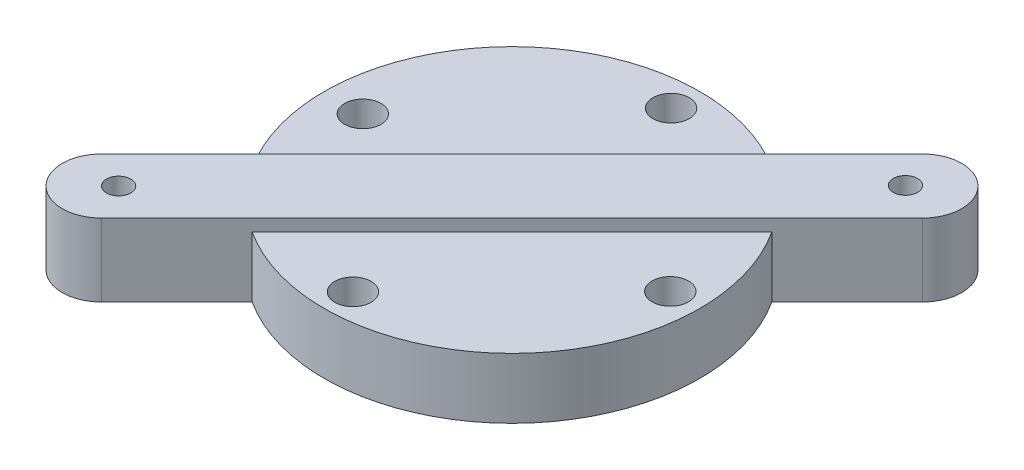
ISO-10303-21;
HEADER;
FILE_DESCRIPTION(('STEP AP214'),'2;1');
FILE_NAME('part.step','',(''),(''),'','','');
FILE_SCHEMA(('AUTOMOTIVE_DESIGN { 1 0 10303 214 1 1 1 1 }'));
ENDSEC;
DATA;
#1=APPLICATION_CONTEXT('core data for automotive mechanical design processes');
#2=APPLICATION_PROTOCOL_DEFINITION('international standard','automotive_design',2000,#1);
#3=PRODUCT_CONTEXT('',#1,'mechanical');
#4=PRODUCT('Part','Part','',(#3));
#5=PRODUCT_RELATED_PRODUCT_CATEGORY('part','',(#4));
#6=PRODUCT_DEFINITION_FORMATION('','',#4);
#7=PRODUCT_DEFINITION_CONTEXT('part definition',#1,'design');
#8=PRODUCT_DEFINITION('design','',#6,#7);
#9=PRODUCT_DEFINITION_SHAPE('','',#8);
#10=(LENGTH_UNIT() NAMED_UNIT(*) SI_UNIT(.MILLI.,.METRE.));
#11=(NAMED_UNIT(*) PLANE_ANGLE_UNIT() SI_UNIT($,.RADIAN.));
#12=(NAMED_UNIT(*) SI_UNIT($,.STERADIAN.) SOLID_ANGLE_UNIT());
#13=UNCERTAINTY_MEASURE_WITH_UNIT(LENGTH_MEASURE(1.E-05),#10,'distance_accuracy_value','');
#14=(GEOMETRIC_REPRESENTATION_CONTEXT(3) GLOBAL_UNCERTAINTY_ASSIGNED_CONTEXT((#13)) GLOBAL_UNIT_ASSIGNED_CONTEXT((#10,
#11,#12)) REPRESENTATION_CONTEXT('',''));
#15=CARTESIAN_POINT('',(0.,0.,0.));
#16=DIRECTION('',(0.,0.,1.));
#17=DIRECTION('',(1.,0.,0.));
#18=AXIS2_PLACEMENT_3D('',#15,#16,#17);
#19=CARTESIAN_POINT('',(0.,10.,0.));
#20=DIRECTION('',(0.,-1.,0.));
#21=DIRECTION('',(0.,0.,-1.));
#22=AXIS2_PLACEMENT_3D('',#19,#20,#21);
#23=CYLINDRICAL_SURFACE('',#22,31.);
#24=DIRECTION('',(0.,-1.,0.));
#25=VECTOR('',#24,1.);
#26=CARTESIAN_POINT('',(26.0154139470055,10.,-16.8581801261569));
#27=LINE('',#26,#25);
#28=CARTESIAN_POINT('',(26.0154139470055,10.,-16.8581801261569));
#29=VERTEX_POINT('',#28);
#30=CARTESIAN_POINT('',(26.0154139470055,0.,-16.8581801261569));
#31=VERTEX_POINT('',#30);
#32=EDGE_CURVE('E158',#29,#31,#27,.T.);
#33=ORIENTED_EDGE('',*,*,#32,.F.);
#34=CARTESIAN_POINT('',(0.,10.,0.));
#35=DIRECTION('',(0.,1.,0.));
#36=DIRECTION('',(0.,0.,1.));
#37=AXIS2_PLACEMENT_3D('',#34,#35,#36);
#38=CIRCLE('',#37,31.);
#39=CARTESIAN_POINT('',(-16.8581801261569,10.,26.0154139470055));
#40=VERTEX_POINT('',#39);
#41=EDGE_CURVE('E54',#40,#29,#38,.T.);
#42=ORIENTED_EDGE('',*,*,#41,.F.);
#43=DIRECTION('',(0.,-1.,0.));
#44=VECTOR('',#43,1.);
#45=CARTESIAN_POINT('',(-16.8581801261568,10.,26.0154139470055));
#46=LINE('',#45,#44);
#47=CARTESIAN_POINT('',(-16.8581801261569,0.,26.0154139470055));
#48=VERTEX_POINT('',#47);
#49=EDGE_CURVE('E69',#48,#40,#46,.F.);
#50=ORIENTED_EDGE('',*,*,#49,.F.);
#51=CARTESIAN_POINT('',(0.,0.,0.));
#52=DIRECTION('',(0.,1.,0.));
#53=DIRECTION('',(0.,0.,1.));
#54=AXIS2_PLACEMENT_3D('',#51,#52,#53);
#55=CIRCLE('',#54,31.);
#56=EDGE_CURVE('E48',#48,#31,#55,.T.);
#57=ORIENTED_EDGE('',*,*,#56,.T.);
#58=EDGE_LOOP('',(#33,#42,#50,#57));
#59=FACE_BOUND('',#58,.T.);
#60=ADVANCED_FACE('F45',(#59),#23,.T.);
#61=DIRECTION('',(0.,-1.,0.));
#62=VECTOR('',#61,1.);
#63=CARTESIAN_POINT('',(-26.0154139470055,10.,16.8581801261569));
#64=LINE('',#63,#62);
#65=CARTESIAN_POINT('',(-26.0154139470055,10.,16.8581801261569));
#66=VERTEX_POINT('',#65);
#67=CARTESIAN_POINT('',(-26.0154139470055,0.,16.8581801261569));
#68=VERTEX_POINT('',#67);
#69=EDGE_CURVE('E150',#66,#68,#64,.T.);
#70=ORIENTED_EDGE('',*,*,#69,.F.);
#71=CARTESIAN_POINT('',(16.8581801261569,10.,-26.0154139470055));
#72=VERTEX_POINT('',#71);
#73=EDGE_CURVE('E11',#72,#66,#38,.T.);
#74=ORIENTED_EDGE('',*,*,#73,.F.);
#75=DIRECTION('',(0.,-1.,0.));
#76=VECTOR('',#75,1.);
#77=CARTESIAN_POINT('',(16.8581801261568,10.,-26.0154139470055));
#78=LINE('',#77,#76);
#79=CARTESIAN_POINT('',(16.8581801261568,0.,-26.0154139470055));
#80=VERTEX_POINT('',#79);
#81=EDGE_CURVE('E61',#80,#72,#78,.F.);
#82=ORIENTED_EDGE('',*,*,#81,.F.);
#83=EDGE_CURVE('E194',#80,#68,#55,.T.);
#84=ORIENTED_EDGE('',*,*,#83,.T.);
#85=EDGE_LOOP('',(#70,#74,#82,#84));
#86=FACE_BOUND('',#85,.T.);
#87=ADVANCED_FACE('F273',(#86),#23,.T.);
#88=CARTESIAN_POINT('',(0.,10.,0.));
#89=DIRECTION('',(0.,1.,0.));
#90=DIRECTION('',(0.,0.,1.));
#91=AXIS2_PLACEMENT_3D('',#88,#89,#90);
#92=PLANE('',#91);
#93=CARTESIAN_POINT('',(26.1230277421703,10.,0.));
#94=DIRECTION('',(0.,1.,0.));
#95=DIRECTION('',(0.,0.,1.));
#96=AXIS2_PLACEMENT_3D('',#93,#94,#95);
#97=CIRCLE('',#96,3.);
#98=CARTESIAN_POINT('',(26.1230277421703,10.,3.));
#99=VERTEX_POINT('',#98);
#100=EDGE_CURVE('E174',#99,#99,#97,.T.);
#101=ORIENTED_EDGE('',*,*,#100,.F.);
#102=EDGE_LOOP('',(#101));
#103=FACE_BOUND('',#102,.T.);
#104=CARTESIAN_POINT('',(0.,10.,26.2486192217));
#105=DIRECTION('',(0.,1.,0.));
#106=DIRECTION('',(0.,0.,1.));
#107=AXIS2_PLACEMENT_3D('',#104,#105,#106);
#108=CIRCLE('',#107,3.);
#109=CARTESIAN_POINT('',(0.,10.,29.2486192217));
#110=VERTEX_POINT('',#109);
#111=EDGE_CURVE('E161',#110,#110,#108,.T.);
#112=ORIENTED_EDGE('',*,*,#111,.F.);
#113=EDGE_LOOP('',(#112));
#114=FACE_BOUND('',#113,.T.);
#115=ORIENTED_EDGE('',*,*,#41,.T.);
#116=DIRECTION('',(-0.707106781186546,0.,0.707106781186549));
#117=VECTOR('',#116,1.);
#118=CARTESIAN_POINT('',(4.57861691042431,10.,4.5786169104243));
#119=LINE('',#118,#117);
#120=EDGE_CURVE('E153',#29,#40,#119,.T.);
#121=ORIENTED_EDGE('',*,*,#120,.T.);
#122=EDGE_LOOP('',(#115,#121));
#123=FACE_BOUND('',#122,.T.);
#124=ADVANCED_FACE('F278',(#103,#114,#123),#92,.T.);
#125=CARTESIAN_POINT('',(-24.6159299878143,10.,0.));
#126=DIRECTION('',(0.,1.,0.));
#127=DIRECTION('',(0.,0.,1.));
#128=AXIS2_PLACEMENT_3D('',#125,#126,#127);
#129=CIRCLE('',#128,3.);
#130=CARTESIAN_POINT('',(-24.6159299878143,10.,3.));
#131=VERTEX_POINT('',#130);
#132=EDGE_CURVE('E182',#131,#131,#129,.T.);
#133=ORIENTED_EDGE('',*,*,#132,.F.);
#134=EDGE_LOOP('',(#133));
#135=FACE_BOUND('',#134,.T.);
#136=CARTESIAN_POINT('',(0.,10.,-26.2486192216999));
#137=DIRECTION('',(0.,1.,0.));
#138=DIRECTION('',(0.,0.,1.));
#139=AXIS2_PLACEMENT_3D('',#136,#137,#138);
#140=CIRCLE('',#139,3.);
#141=CARTESIAN_POINT('',(0.,10.,-23.2486192216999));
#142=VERTEX_POINT('',#141);
#143=EDGE_CURVE('E162',#142,#142,#140,.T.);
#144=ORIENTED_EDGE('',*,*,#143,.F.);
#145=EDGE_LOOP('',(#144));
#146=FACE_BOUND('',#145,.T.);
#147=ORIENTED_EDGE('',*,*,#73,.T.);
#148=DIRECTION('',(0.707106781186546,0.,-0.707106781186549));
#149=VECTOR('',#148,1.);
#150=CARTESIAN_POINT('',(-4.57861691042431,10.,-4.5786169104243));
#151=LINE('',#150,#149);
#152=EDGE_CURVE('E139',#66,#72,#151,.T.);
#153=ORIENTED_EDGE('',*,*,#152,.T.);
#154=EDGE_LOOP('',(#147,#153));
#155=FACE_BOUND('',#154,.T.);
#156=ADVANCED_FACE('F282',(#135,#146,#155),#92,.T.);
#157=CARTESIAN_POINT('',(0.,0.,0.));
#158=DIRECTION('',(0.,1.,0.));
#159=DIRECTION('',(0.,0.,1.));
#160=AXIS2_PLACEMENT_3D('',#157,#158,#159);
#161=PLANE('',#160);
#162=ORIENTED_EDGE('',*,*,#83,.F.);
#163=DIRECTION('',(-0.707106781186546,0.,0.707106781186549));
#164=VECTOR('',#163,1.);
#165=CARTESIAN_POINT('',(-38.4490066018234,0.,29.2917727809749));
#166=LINE('',#165,#164);
#167=CARTESIAN_POINT('',(29.2917727809748,0.,-38.4490066018235));
#168=VERTEX_POINT('',#167);
#169=EDGE_CURVE('E133',#168,#80,#166,.T.);
#170=ORIENTED_EDGE('',*,*,#169,.F.);
#171=CARTESIAN_POINT('',(33.8703896913991,0.,-33.8703896913992));
#172=DIRECTION('',(0.,1.,0.));
#173=DIRECTION('',(0.,0.,1.));
#174=AXIS2_PLACEMENT_3D('',#171,#172,#173);
#175=CIRCLE('',#174,6.47514213163285);
#176=CARTESIAN_POINT('',(38.4490066018234,0.,-29.2917727809749));
#177=VERTEX_POINT('',#176);
#178=EDGE_CURVE('E215',#177,#168,#175,.T.);
#179=ORIENTED_EDGE('',*,*,#178,.F.);
#180=DIRECTION('',(0.707106781186546,0.,-0.707106781186549));
#181=VECTOR('',#180,1.);
#182=CARTESIAN_POINT('',(-29.2917727809748,0.,38.4490066018235));
#183=LINE('',#182,#181);
#184=EDGE_CURVE('E213',#31,#177,#183,.T.);
#185=ORIENTED_EDGE('',*,*,#184,.F.);
#186=ORIENTED_EDGE('',*,*,#56,.F.);
#187=CARTESIAN_POINT('',(-29.2917727809748,0.,38.4490066018235));
#188=VERTEX_POINT('',#187);
#189=EDGE_CURVE('E211',#188,#48,#183,.T.);
#190=ORIENTED_EDGE('',*,*,#189,.F.);
#191=CARTESIAN_POINT('',(-33.8703896913991,0.,33.8703896913992));
#192=DIRECTION('',(0.,1.,0.));
#193=DIRECTION('',(0.,0.,1.));
#194=AXIS2_PLACEMENT_3D('',#191,#192,#193);
#195=CIRCLE('',#194,6.47514213163285);
#196=CARTESIAN_POINT('',(-38.4490066018234,0.,29.2917727809749));
#197=VERTEX_POINT('',#196);
#198=EDGE_CURVE('E137',#197,#188,#195,.T.);
#199=ORIENTED_EDGE('',*,*,#198,.F.);
#200=EDGE_CURVE('E226',#68,#197,#166,.T.);
#201=ORIENTED_EDGE('',*,*,#200,.F.);
#202=EDGE_LOOP('',(#162,#170,#179,#185,#186,#190,#199,#201));
#203=FACE_BOUND('',#202,.T.);
#204=CARTESIAN_POINT('',(-24.6159299878143,0.,0.));
#205=DIRECTION('',(0.,1.,0.));
#206=DIRECTION('',(0.,0.,1.));
#207=AXIS2_PLACEMENT_3D('',#204,#205,#206);
#208=CIRCLE('',#207,3.);
#209=CARTESIAN_POINT('',(-24.6159299878143,0.,3.));
#210=VERTEX_POINT('',#209);
#211=EDGE_CURVE('E178',#210,#210,#208,.T.);
#212=ORIENTED_EDGE('',*,*,#211,.T.);
#213=EDGE_LOOP('',(#212));
#214=FACE_BOUND('',#213,.T.);
#215=CARTESIAN_POINT('',(0.,0.,-26.2486192216999));
#216=DIRECTION('',(0.,1.,0.));
#217=DIRECTION('',(0.,0.,1.));
#218=AXIS2_PLACEMENT_3D('',#215,#216,#217);
#219=CIRCLE('',#218,3.);
#220=CARTESIAN_POINT('',(0.,0.,-23.2486192216999));
#221=VERTEX_POINT('',#220);
#222=EDGE_CURVE('E166',#221,#221,#219,.T.);
#223=ORIENTED_EDGE('',*,*,#222,.T.);
#224=EDGE_LOOP('',(#223));
#225=FACE_BOUND('',#224,.T.);
#226=CARTESIAN_POINT('',(0.,0.,26.2486192217));
#227=DIRECTION('',(0.,1.,0.));
#228=DIRECTION('',(0.,0.,1.));
#229=AXIS2_PLACEMENT_3D('',#226,#227,#228);
#230=CIRCLE('',#229,3.);
#231=CARTESIAN_POINT('',(0.,0.,29.2486192217));
#232=VERTEX_POINT('',#231);
#233=EDGE_CURVE('E186',#232,#232,#230,.T.);
#234=ORIENTED_EDGE('',*,*,#233,.T.);
#235=EDGE_LOOP('',(#234));
#236=FACE_BOUND('',#235,.T.);
#237=CARTESIAN_POINT('',(26.1230277421703,0.,0.));
#238=DIRECTION('',(0.,1.,0.));
#239=DIRECTION('',(0.,0.,1.));
#240=AXIS2_PLACEMENT_3D('',#237,#238,#239);
#241=CIRCLE('',#240,3.);
#242=CARTESIAN_POINT('',(26.1230277421703,0.,3.));
#243=VERTEX_POINT('',#242);
#244=EDGE_CURVE('E170',#243,#243,#241,.T.);
#245=ORIENTED_EDGE('',*,*,#244,.T.);
#246=EDGE_LOOP('',(#245));
#247=FACE_BOUND('',#246,.T.);
#248=CARTESIAN_POINT('',(-32.456176129026,0.,32.4561761290261));
#249=DIRECTION('',(0.,1.,0.));
#250=DIRECTION('',(0.,0.,1.));
#251=AXIS2_PLACEMENT_3D('',#248,#249,#250);
#252=CIRCLE('',#251,2.);
#253=CARTESIAN_POINT('',(-32.456176129026,0.,34.4561761290261));
#254=VERTEX_POINT('',#253);
#255=EDGE_CURVE('E250',#254,#254,#252,.T.);
#256=ORIENTED_EDGE('',*,*,#255,.T.);
#257=EDGE_LOOP('',(#256));
#258=FACE_BOUND('',#257,.T.);
#259=CARTESIAN_POINT('',(32.3762467728126,0.,-32.5409022191612));
#260=DIRECTION('',(0.,1.,0.));
#261=DIRECTION('',(0.,0.,1.));
#262=AXIS2_PLACEMENT_3D('',#259,#260,#261);
#263=CIRCLE('',#262,2.);
#264=CARTESIAN_POINT('',(32.3762467728126,0.,-30.5409022191612));
#265=VERTEX_POINT('',#264);
#266=EDGE_CURVE('E242',#265,#265,#263,.T.);
#267=ORIENTED_EDGE('',*,*,#266,.T.);
#268=EDGE_LOOP('',(#267));
#269=FACE_BOUND('',#268,.T.);
#270=ADVANCED_FACE('F209',(#203,#214,#225,#236,#247,#258,#269),#161,.F.);
#271=CARTESIAN_POINT('',(0.,10.,26.2486192217));
#272=DIRECTION('',(0.,-1.,0.));
#273=DIRECTION('',(0.,0.,-1.));
#274=AXIS2_PLACEMENT_3D('',#271,#272,#273);
#275=CYLINDRICAL_SURFACE('',#274,3.);
#276=ORIENTED_EDGE('',*,*,#111,.T.);
#277=EDGE_LOOP('',(#276));
#278=FACE_BOUND('',#277,.T.);
#279=ORIENTED_EDGE('',*,*,#233,.F.);
#280=EDGE_LOOP('',(#279));
#281=FACE_BOUND('',#280,.T.);
#282=ADVANCED_FACE('F292',(#278,#281),#275,.F.);
#283=CARTESIAN_POINT('',(-24.6159299878143,10.,0.));
#284=DIRECTION('',(0.,-1.,0.));
#285=DIRECTION('',(0.,0.,-1.));
#286=AXIS2_PLACEMENT_3D('',#283,#284,#285);
#287=CYLINDRICAL_SURFACE('',#286,3.);
#288=ORIENTED_EDGE('',*,*,#132,.T.);
#289=EDGE_LOOP('',(#288));
#290=FACE_BOUND('',#289,.T.);
#291=ORIENTED_EDGE('',*,*,#211,.F.);
#292=EDGE_LOOP('',(#291));
#293=FACE_BOUND('',#292,.T.);
#294=ADVANCED_FACE('F298',(#290,#293),#287,.F.);
#295=CARTESIAN_POINT('',(26.1230277421703,10.,0.));
#296=DIRECTION('',(0.,-1.,0.));
#297=DIRECTION('',(0.,0.,-1.));
#298=AXIS2_PLACEMENT_3D('',#295,#296,#297);
#299=CYLINDRICAL_SURFACE('',#298,3.);
#300=ORIENTED_EDGE('',*,*,#100,.T.);
#301=EDGE_LOOP('',(#300));
#302=FACE_BOUND('',#301,.T.);
#303=ORIENTED_EDGE('',*,*,#244,.F.);
#304=EDGE_LOOP('',(#303));
#305=FACE_BOUND('',#304,.T.);
#306=ADVANCED_FACE('F302',(#302,#305),#299,.F.);
#307=CARTESIAN_POINT('',(0.,10.,-26.2486192216999));
#308=DIRECTION('',(0.,-1.,0.));
#309=DIRECTION('',(0.,0.,-1.));
#310=AXIS2_PLACEMENT_3D('',#307,#308,#309);
#311=CYLINDRICAL_SURFACE('',#310,3.);
#312=ORIENTED_EDGE('',*,*,#143,.T.);
#313=EDGE_LOOP('',(#312));
#314=FACE_BOUND('',#313,.T.);
#315=ORIENTED_EDGE('',*,*,#222,.F.);
#316=EDGE_LOOP('',(#315));
#317=FACE_BOUND('',#316,.T.);
#318=ADVANCED_FACE('F306',(#314,#317),#311,.F.);
#319=CARTESIAN_POINT('',(-29.2917727809748,12.,38.4490066018235));
#320=DIRECTION('',(-0.707106781186549,0.,-0.707106781186546));
#321=DIRECTION('',(-0.707106781186546,0.,0.707106781186549));
#322=AXIS2_PLACEMENT_3D('',#319,#320,#321);
#323=PLANE('',#322);
#324=ORIENTED_EDGE('',*,*,#120,.F.);
#325=ORIENTED_EDGE('',*,*,#32,.T.);
#326=ORIENTED_EDGE('',*,*,#184,.T.);
#327=DIRECTION('',(0.,-1.,0.));
#328=VECTOR('',#327,1.);
#329=CARTESIAN_POINT('',(38.4490066018234,12.,-29.2917727809749));
#330=LINE('',#329,#328);
#331=CARTESIAN_POINT('',(38.4490066018234,12.,-29.2917727809749));
#332=VERTEX_POINT('',#331);
#333=EDGE_CURVE('E117',#332,#177,#330,.T.);
#334=ORIENTED_EDGE('',*,*,#333,.F.);
#335=DIRECTION('',(0.707106781186546,0.,-0.707106781186549));
#336=VECTOR('',#335,1.);
#337=CARTESIAN_POINT('',(-29.2917727809748,12.,38.4490066018235));
#338=LINE('',#337,#336);
#339=CARTESIAN_POINT('',(-29.2917727809748,12.,38.4490066018235));
#340=VERTEX_POINT('',#339);
#341=EDGE_CURVE('E110',#340,#332,#338,.T.);
#342=ORIENTED_EDGE('',*,*,#341,.F.);
#343=DIRECTION('',(0.,-1.,0.));
#344=VECTOR('',#343,1.);
#345=CARTESIAN_POINT('',(-29.2917727809748,12.,38.4490066018235));
#346=LINE('',#345,#344);
#347=EDGE_CURVE('E114',#340,#188,#346,.T.);
#348=ORIENTED_EDGE('',*,*,#347,.T.);
#349=ORIENTED_EDGE('',*,*,#189,.T.);
#350=ORIENTED_EDGE('',*,*,#49,.T.);
#351=EDGE_LOOP('',(#324,#325,#326,#334,#342,#348,#349,#350));
#352=FACE_BOUND('',#351,.T.);
#353=ADVANCED_FACE('F112',(#352),#323,.F.);
#354=CARTESIAN_POINT('',(-38.4490066018234,12.,29.2917727809749));
#355=DIRECTION('',(0.707106781186549,0.,0.707106781186546));
#356=DIRECTION('',(0.707106781186546,0.,-0.707106781186549));
#357=AXIS2_PLACEMENT_3D('',#354,#355,#356);
#358=PLANE('',#357);
#359=ORIENTED_EDGE('',*,*,#152,.F.);
#360=ORIENTED_EDGE('',*,*,#69,.T.);
#361=ORIENTED_EDGE('',*,*,#200,.T.);
#362=DIRECTION('',(0.,-1.,0.));
#363=VECTOR('',#362,1.);
#364=CARTESIAN_POINT('',(-38.4490066018234,12.,29.2917727809749));
#365=LINE('',#364,#363);
#366=CARTESIAN_POINT('',(-38.4490066018234,12.,29.2917727809749));
#367=VERTEX_POINT('',#366);
#368=EDGE_CURVE('E229',#367,#197,#365,.T.);
#369=ORIENTED_EDGE('',*,*,#368,.F.);
#370=DIRECTION('',(-0.707106781186546,0.,0.707106781186549));
#371=VECTOR('',#370,1.);
#372=CARTESIAN_POINT('',(-38.4490066018234,12.,29.2917727809749));
#373=LINE('',#372,#371);
#374=CARTESIAN_POINT('',(29.2917727809748,12.,-38.4490066018235));
#375=VERTEX_POINT('',#374);
#376=EDGE_CURVE('E128',#375,#367,#373,.T.);
#377=ORIENTED_EDGE('',*,*,#376,.F.);
#378=DIRECTION('',(0.,-1.,0.));
#379=VECTOR('',#378,1.);
#380=CARTESIAN_POINT('',(29.2917727809748,12.,-38.4490066018235));
#381=LINE('',#380,#379);
#382=EDGE_CURVE('E144',#375,#168,#381,.T.);
#383=ORIENTED_EDGE('',*,*,#382,.T.);
#384=ORIENTED_EDGE('',*,*,#169,.T.);
#385=ORIENTED_EDGE('',*,*,#81,.T.);
#386=EDGE_LOOP('',(#359,#360,#361,#369,#377,#383,#384,#385));
#387=FACE_BOUND('',#386,.T.);
#388=ADVANCED_FACE('F234',(#387),#358,.F.);
#389=CARTESIAN_POINT('',(-33.8703896913991,12.,33.8703896913992));
#390=DIRECTION('',(0.,1.,0.));
#391=DIRECTION('',(0.,0.,1.));
#392=AXIS2_PLACEMENT_3D('',#389,#390,#391);
#393=PLANE('',#392);
#394=CARTESIAN_POINT('',(32.3762467728126,12.,-32.5409022191612));
#395=DIRECTION('',(0.,1.,0.));
#396=DIRECTION('',(0.,0.,1.));
#397=AXIS2_PLACEMENT_3D('',#394,#395,#396);
#398=CIRCLE('',#397,2.);
#399=CARTESIAN_POINT('',(32.3762467728126,12.,-30.5409022191612));
#400=VERTEX_POINT('',#399);
#401=EDGE_CURVE('E220',#400,#400,#398,.T.);
#402=ORIENTED_EDGE('',*,*,#401,.F.);
#403=EDGE_LOOP('',(#402));
#404=FACE_BOUND('',#403,.T.);
#405=CARTESIAN_POINT('',(-33.8703896913991,12.,33.8703896913992));
#406=DIRECTION('',(0.,1.,0.));
#407=DIRECTION('',(0.,0.,1.));
#408=AXIS2_PLACEMENT_3D('',#405,#406,#407);
#409=CIRCLE('',#408,6.47514213163285);
#410=EDGE_CURVE('E122',#367,#340,#409,.T.);
#411=ORIENTED_EDGE('',*,*,#410,.T.);
#412=ORIENTED_EDGE('',*,*,#341,.T.);
#413=CARTESIAN_POINT('',(33.8703896913991,12.,-33.8703896913992));
#414=DIRECTION('',(0.,1.,0.));
#415=DIRECTION('',(0.,0.,1.));
#416=AXIS2_PLACEMENT_3D('',#413,#414,#415);
#417=CIRCLE('',#416,6.47514213163285);
#418=EDGE_CURVE('E121',#332,#375,#417,.T.);
#419=ORIENTED_EDGE('',*,*,#418,.T.);
#420=ORIENTED_EDGE('',*,*,#376,.T.);
#421=EDGE_LOOP('',(#411,#412,#419,#420));
#422=FACE_BOUND('',#421,.T.);
#423=CARTESIAN_POINT('',(-32.456176129026,12.,32.4561761290261));
#424=DIRECTION('',(0.,1.,0.));
#425=DIRECTION('',(0.,0.,1.));
#426=AXIS2_PLACEMENT_3D('',#423,#424,#425);
#427=CIRCLE('',#426,2.);
#428=CARTESIAN_POINT('',(-32.456176129026,12.,34.4561761290261));
#429=VERTEX_POINT('',#428);
#430=EDGE_CURVE('E246',#429,#429,#427,.T.);
#431=ORIENTED_EDGE('',*,*,#430,.F.);
#432=EDGE_LOOP('',(#431));
#433=FACE_BOUND('',#432,.T.);
#434=ADVANCED_FACE('F125',(#404,#422,#433),#393,.T.);
#435=CARTESIAN_POINT('',(-33.8703896913991,12.,33.8703896913992));
#436=DIRECTION('',(0.,-1.,0.));
#437=DIRECTION('',(0.,0.,-1.));
#438=AXIS2_PLACEMENT_3D('',#435,#436,#437);
#439=CYLINDRICAL_SURFACE('',#438,6.47514213163285);
#440=ORIENTED_EDGE('',*,*,#198,.T.);
#441=ORIENTED_EDGE('',*,*,#347,.F.);
#442=ORIENTED_EDGE('',*,*,#410,.F.);
#443=ORIENTED_EDGE('',*,*,#368,.T.);
#444=EDGE_LOOP('',(#440,#441,#442,#443));
#445=FACE_BOUND('',#444,.T.);
#446=ADVANCED_FACE('F135',(#445),#439,.T.);
#447=CARTESIAN_POINT('',(33.8703896913991,12.,-33.8703896913992));
#448=DIRECTION('',(0.,-1.,0.));
#449=DIRECTION('',(0.,0.,-1.));
#450=AXIS2_PLACEMENT_3D('',#447,#448,#449);
#451=CYLINDRICAL_SURFACE('',#450,6.47514213163285);
#452=ORIENTED_EDGE('',*,*,#178,.T.);
#453=ORIENTED_EDGE('',*,*,#382,.F.);
#454=ORIENTED_EDGE('',*,*,#418,.F.);
#455=ORIENTED_EDGE('',*,*,#333,.T.);
#456=EDGE_LOOP('',(#452,#453,#454,#455));
#457=FACE_BOUND('',#456,.T.);
#458=ADVANCED_FACE('F267',(#457),#451,.T.);
#459=CARTESIAN_POINT('',(32.3762467728126,12.,-32.5409022191612));
#460=DIRECTION('',(0.,-1.,0.));
#461=DIRECTION('',(0.,0.,-1.));
#462=AXIS2_PLACEMENT_3D('',#459,#460,#461);
#463=CYLINDRICAL_SURFACE('',#462,2.);
#464=ORIENTED_EDGE('',*,*,#401,.T.);
#465=EDGE_LOOP('',(#464));
#466=FACE_BOUND('',#465,.T.);
#467=ORIENTED_EDGE('',*,*,#266,.F.);
#468=EDGE_LOOP('',(#467));
#469=FACE_BOUND('',#468,.T.);
#470=ADVANCED_FACE('F313',(#466,#469),#463,.F.);
#471=CARTESIAN_POINT('',(-32.456176129026,12.,32.4561761290261));
#472=DIRECTION('',(0.,-1.,0.));
#473=DIRECTION('',(0.,0.,-1.));
#474=AXIS2_PLACEMENT_3D('',#471,#472,#473);
#475=CYLINDRICAL_SURFACE('',#474,2.);
#476=ORIENTED_EDGE('',*,*,#430,.T.);
#477=EDGE_LOOP('',(#476));
#478=FACE_BOUND('',#477,.T.);
#479=ORIENTED_EDGE('',*,*,#255,.F.);
#480=EDGE_LOOP('',(#479));
#481=FACE_BOUND('',#480,.T.);
#482=ADVANCED_FACE('F258',(#478,#481),#475,.F.);
#483=CLOSED_SHELL('',(#60,#87,#124,#156,#270,#282,#294,#306,#318,#353,#388,#434,#446,#458,#470,#482));
#484=MANIFOLD_SOLID_BREP('B2',#483);
#485=ADVANCED_BREP_SHAPE_REPRESENTATION('',(#18,#484),#14);
#486=SHAPE_DEFINITION_REPRESENTATION(#9,#485);
ENDSEC;
END-ISO-10303-21;
